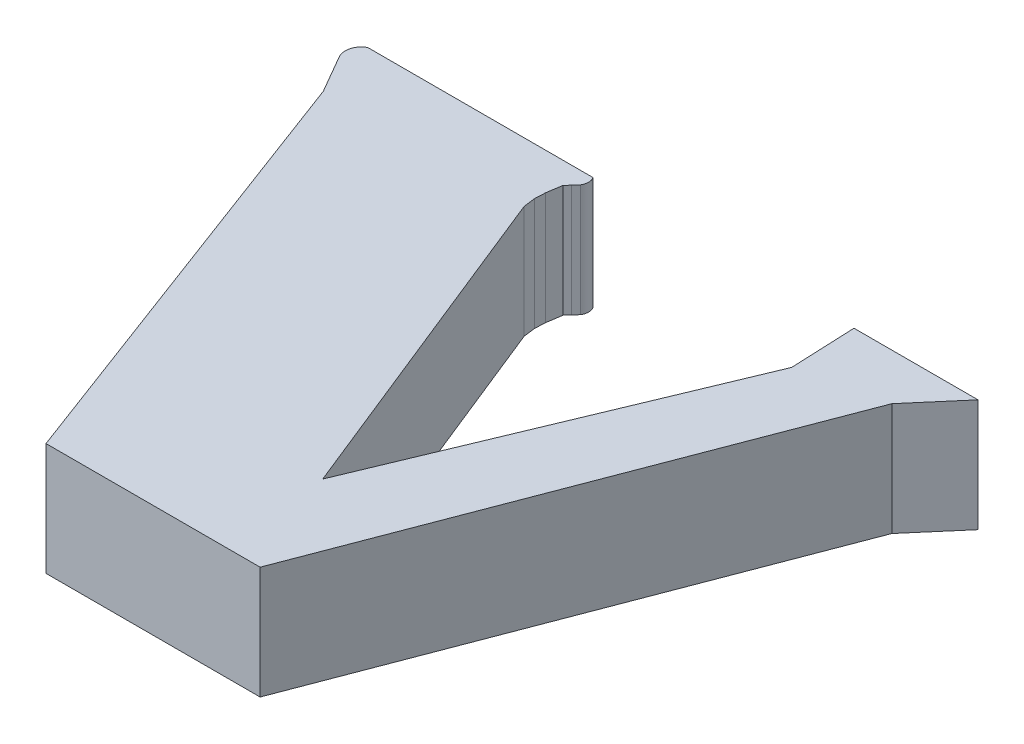
ISO-10303-21;
HEADER;
FILE_DESCRIPTION(('STEP AP214'),'2;1');
FILE_NAME('part.step','',(''),(''),'','','');
FILE_SCHEMA(('AUTOMOTIVE_DESIGN { 1 0 10303 214 1 1 1 1 }'));
ENDSEC;
DATA;
#1=APPLICATION_CONTEXT('core data for automotive mechanical design processes');
#2=APPLICATION_PROTOCOL_DEFINITION('international standard','automotive_design',2000,#1);
#3=PRODUCT_CONTEXT('',#1,'mechanical');
#4=PRODUCT('Part','Part','',(#3));
#5=PRODUCT_RELATED_PRODUCT_CATEGORY('part','',(#4));
#6=PRODUCT_DEFINITION_FORMATION('','',#4);
#7=PRODUCT_DEFINITION_CONTEXT('part definition',#1,'design');
#8=PRODUCT_DEFINITION('design','',#6,#7);
#9=PRODUCT_DEFINITION_SHAPE('','',#8);
#10=(LENGTH_UNIT() NAMED_UNIT(*) SI_UNIT(.MILLI.,.METRE.));
#11=(NAMED_UNIT(*) PLANE_ANGLE_UNIT() SI_UNIT($,.RADIAN.));
#12=(NAMED_UNIT(*) SI_UNIT($,.STERADIAN.) SOLID_ANGLE_UNIT());
#13=UNCERTAINTY_MEASURE_WITH_UNIT(LENGTH_MEASURE(1.E-05),#10,'distance_accuracy_value','');
#14=(GEOMETRIC_REPRESENTATION_CONTEXT(3) GLOBAL_UNCERTAINTY_ASSIGNED_CONTEXT((#13)) GLOBAL_UNIT_ASSIGNED_CONTEXT((#10,
#11,#12)) REPRESENTATION_CONTEXT('',''));
#15=CARTESIAN_POINT('',(0.,0.,0.));
#16=DIRECTION('',(0.,0.,1.));
#17=DIRECTION('',(1.,0.,0.));
#18=AXIS2_PLACEMENT_3D('',#15,#16,#17);
#19=CARTESIAN_POINT('',(60.4204006314875,66.7433443998356,51.260260517115));
#20=DIRECTION('',(0.,1.,0.));
#21=DIRECTION('',(1.,0.,0.));
#22=AXIS2_PLACEMENT_3D('',#19,#20,#21);
#23=PLANE('',#22);
#24=DIRECTION('',(0.351178794434307,0.,0.936308418385559));
#25=VECTOR('',#24,1.);
#26=CARTESIAN_POINT('',(58.4655751220041,66.7433443998356,51.788073542055));
#27=LINE('',#26,#25);
#28=CARTESIAN_POINT('',(58.4655751220041,66.7433443998356,51.788073542055));
#29=VERTEX_POINT('',#28);
#30=CARTESIAN_POINT('',(60.0930117335328,66.7433443998356,56.1271242589919));
#31=VERTEX_POINT('',#30);
#32=EDGE_CURVE('E404',#29,#31,#27,.T.);
#33=ORIENTED_EDGE('',*,*,#32,.F.);
#34=DIRECTION('',(0.500336982862697,0.,0.865830759201735));
#35=VECTOR('',#34,1.);
#36=CARTESIAN_POINT('',(58.2572211639987,66.7433443998356,51.4275180128389));
#37=LINE('',#36,#35);
#38=CARTESIAN_POINT('',(58.2572211639943,66.7433443998356,51.4275180128407));
#39=VERTEX_POINT('',#38);
#40=EDGE_CURVE('E26',#39,#29,#37,.T.);
#41=ORIENTED_EDGE('',*,*,#40,.F.);
#42=CARTESIAN_POINT('',(58.3891279958467,66.7433443998356,51.3379936652546));
#43=DIRECTION('',(0.,1.,0.));
#44=DIRECTION('',(1.,0.,0.));
#45=AXIS2_PLACEMENT_3D('',#42,#43,#44);
#46=CIRCLE('',#45,0.159417756539472);
#47=CARTESIAN_POINT('',(58.2297102393072,66.7433443998356,51.3379936652546));
#48=VERTEX_POINT('',#47);
#49=EDGE_CURVE('E381',#48,#39,#46,.T.);
#50=ORIENTED_EDGE('',*,*,#49,.F.);
#51=CARTESIAN_POINT('',(58.3891279958467,66.7433443998356,51.3379936652546));
#52=DIRECTION('',(0.,1.,0.));
#53=DIRECTION('',(1.,0.,0.));
#54=AXIS2_PLACEMENT_3D('',#51,#52,#53);
#55=CIRCLE('',#54,0.159417756539472);
#56=CARTESIAN_POINT('',(58.3108923087117,66.7433443998356,51.1990937071586));
#57=VERTEX_POINT('',#56);
#58=EDGE_CURVE('E167',#57,#48,#55,.T.);
#59=ORIENTED_EDGE('',*,*,#58,.F.);
#60=DIRECTION('',(-1.,0.,0.));
#61=VECTOR('',#60,1.);
#62=CARTESIAN_POINT('',(60.5154702295912,66.7433443998356,51.1990937071586));
#63=LINE('',#62,#61);
#64=CARTESIAN_POINT('',(60.5154702295979,66.7433443998356,51.1990937071595));
#65=VERTEX_POINT('',#64);
#66=EDGE_CURVE('E159',#65,#57,#63,.T.);
#67=ORIENTED_EDGE('',*,*,#66,.F.);
#68=CARTESIAN_POINT('',(60.4204006314875,66.7433443998356,51.260260517115));
#69=DIRECTION('',(0.,1.,0.));
#70=DIRECTION('',(1.,0.,0.));
#71=AXIS2_PLACEMENT_3D('',#68,#69,#70);
#72=CIRCLE('',#71,0.11304692443858);
#73=CARTESIAN_POINT('',(60.5154702295912,66.7433443998356,51.3214273270705));
#74=VERTEX_POINT('',#73);
#75=EDGE_CURVE('E163',#74,#65,#72,.T.);
#76=ORIENTED_EDGE('',*,*,#75,.F.);
#77=DIRECTION('',(0.655192979641865,0.,-0.755461553904641));
#78=VECTOR('',#77,1.);
#79=CARTESIAN_POINT('',(60.4733921812731,66.7433443998356,51.3699448612252));
#80=LINE('',#79,#78);
#81=CARTESIAN_POINT('',(60.4733921812731,66.7433443998356,51.3699448612252));
#82=VERTEX_POINT('',#81);
#83=EDGE_CURVE('E283',#82,#74,#80,.T.);
#84=ORIENTED_EDGE('',*,*,#83,.F.);
#85=DIRECTION('',(0.678534277173213,0.,-0.734568740623385));
#86=VECTOR('',#85,1.);
#87=CARTESIAN_POINT('',(60.4345512028035,66.7433443998356,51.4119933908261));
#88=LINE('',#87,#86);
#89=CARTESIAN_POINT('',(60.4345512028035,66.7433443998356,51.4119933908261));
#90=VERTEX_POINT('',#89);
#91=EDGE_CURVE('E266',#90,#82,#88,.T.);
#92=ORIENTED_EDGE('',*,*,#91,.F.);
#93=DIRECTION('',(0.149058888682834,0.,-0.988828320642486));
#94=VECTOR('',#93,1.);
#95=CARTESIAN_POINT('',(60.4123535006281,66.7433443998356,51.559248725669));
#96=LINE('',#95,#94);
#97=CARTESIAN_POINT('',(60.4123535006281,66.7433443998356,51.559248725669));
#98=VERTEX_POINT('',#97);
#99=EDGE_CURVE('E258',#98,#90,#96,.T.);
#100=ORIENTED_EDGE('',*,*,#99,.F.);
#101=DIRECTION('',(0.0475988154380199,0.,-0.998866534011876));
#102=VECTOR('',#101,1.);
#103=CARTESIAN_POINT('',(60.4073127950875,66.7433443998356,51.6650285024535));
#104=LINE('',#103,#102);
#105=CARTESIAN_POINT('',(60.4073127950875,66.7433443998356,51.6650285024535));
#106=VERTEX_POINT('',#105);
#107=EDGE_CURVE('E249',#106,#98,#104,.T.);
#108=ORIENTED_EDGE('',*,*,#107,.F.);
#109=DIRECTION('',(-0.126886204003881,0.,-0.991917280438992));
#110=VECTOR('',#109,1.);
#111=CARTESIAN_POINT('',(60.4218573272124,66.7433443998356,51.7787285919459));
#112=LINE('',#111,#110);
#113=CARTESIAN_POINT('',(60.4218573272124,66.7433443998356,51.7787285919459));
#114=VERTEX_POINT('',#113);
#115=EDGE_CURVE('E240',#114,#106,#112,.T.);
#116=ORIENTED_EDGE('',*,*,#115,.F.);
#117=DIRECTION('',(-0.373019319199074,0.,-0.927823575635077));
#118=VECTOR('',#117,1.);
#119=CARTESIAN_POINT('',(61.7469038906855,66.7433443998356,55.0745617489103));
#120=LINE('',#119,#118);
#121=CARTESIAN_POINT('',(61.7469038906855,66.7433443998356,55.0745617489103));
#122=VERTEX_POINT('',#121);
#123=EDGE_CURVE('E228',#122,#114,#120,.T.);
#124=ORIENTED_EDGE('',*,*,#123,.F.);
#125=DIRECTION('',(-0.384147707730565,0.,0.923271649432253));
#126=VECTOR('',#125,1.);
#127=CARTESIAN_POINT('',(63.0944544936692,66.7433443998356,51.8358198720936));
#128=LINE('',#127,#126);
#129=CARTESIAN_POINT('',(63.0944544936692,66.7433443998356,51.8358198720936));
#130=VERTEX_POINT('',#129);
#131=EDGE_CURVE('E219',#130,#122,#128,.T.);
#132=ORIENTED_EDGE('',*,*,#131,.F.);
#133=DIRECTION('',(0.0425885629400182,0.,0.999092695552672));
#134=VECTOR('',#133,1.);
#135=CARTESIAN_POINT('',(63.0673126153714,66.7433443998356,51.1990937071586));
#136=LINE('',#135,#134);
#137=CARTESIAN_POINT('',(63.0673126153714,66.7433443998356,51.1990937071586));
#138=VERTEX_POINT('',#137);
#139=EDGE_CURVE('E314',#138,#130,#136,.T.);
#140=ORIENTED_EDGE('',*,*,#139,.F.);
#141=DIRECTION('',(-1.,0.,0.));
#142=VECTOR('',#141,1.);
#143=CARTESIAN_POINT('',(64.2802944204693,66.7433443998356,51.1990937071586));
#144=LINE('',#143,#142);
#145=CARTESIAN_POINT('',(64.2802944204693,66.7433443998356,51.1990937071586));
#146=VERTEX_POINT('',#145);
#147=EDGE_CURVE('E302',#146,#138,#144,.T.);
#148=ORIENTED_EDGE('',*,*,#147,.F.);
#149=DIRECTION('',(0.650442835926794,0.,-0.759555210100958));
#150=VECTOR('',#149,1.);
#151=CARTESIAN_POINT('',(63.8916979560522,66.7433443998356,51.6528775800399));
#152=LINE('',#151,#150);
#153=CARTESIAN_POINT('',(63.8916979560522,66.7433443998356,51.6528775800399));
#154=VERTEX_POINT('',#153);
#155=EDGE_CURVE('E292',#154,#146,#152,.T.);
#156=ORIENTED_EDGE('',*,*,#155,.F.);
#157=DIRECTION('',(0.355999055886694,0.,-0.934486314617706));
#158=VECTOR('',#157,1.);
#159=CARTESIAN_POINT('',(62.1872025893516,66.7433443998356,56.1271242589919));
#160=LINE('',#159,#158);
#161=CARTESIAN_POINT('',(62.1872025893516,66.7433443998356,56.1271242589919));
#162=VERTEX_POINT('',#161);
#163=EDGE_CURVE('E288',#162,#154,#160,.T.);
#164=ORIENTED_EDGE('',*,*,#163,.F.);
#165=DIRECTION('',(1.,0.,0.));
#166=VECTOR('',#165,1.);
#167=CARTESIAN_POINT('',(60.0930117335328,66.7433443998356,56.1271242589919));
#168=LINE('',#167,#166);
#169=EDGE_CURVE('E426',#31,#162,#168,.T.);
#170=ORIENTED_EDGE('',*,*,#169,.F.);
#171=EDGE_LOOP('',(#33,#41,#50,#59,#67,#76,#84,#92,#100,#108,#116,#124,#132,#140,#148,#156,#164,#170));
#172=FACE_BOUND('',#171,.T.);
#173=ADVANCED_FACE('F16',(#172),#23,.F.);
#174=CARTESIAN_POINT('',(60.4204006314875,67.8433443998356,51.260260517115));
#175=DIRECTION('',(0.,1.,0.));
#176=DIRECTION('',(1.,0.,0.));
#177=AXIS2_PLACEMENT_3D('',#174,#175,#176);
#178=PLANE('',#177);
#179=DIRECTION('',(0.351178794434307,0.,0.936308418385559));
#180=VECTOR('',#179,1.);
#181=CARTESIAN_POINT('',(58.4655751220041,67.8433443998356,51.788073542055));
#182=LINE('',#181,#180);
#183=CARTESIAN_POINT('',(58.4655751220041,67.8433443998356,51.788073542055));
#184=VERTEX_POINT('',#183);
#185=CARTESIAN_POINT('',(60.0930117335328,67.8433443998356,56.1271242589919));
#186=VERTEX_POINT('',#185);
#187=EDGE_CURVE('E339',#184,#186,#182,.T.);
#188=ORIENTED_EDGE('',*,*,#187,.T.);
#189=DIRECTION('',(1.,0.,0.));
#190=VECTOR('',#189,1.);
#191=CARTESIAN_POINT('',(60.0930117335328,67.8433443998356,56.1271242589919));
#192=LINE('',#191,#190);
#193=CARTESIAN_POINT('',(62.1872025893516,67.8433443998356,56.1271242589919));
#194=VERTEX_POINT('',#193);
#195=EDGE_CURVE('E287',#186,#194,#192,.T.);
#196=ORIENTED_EDGE('',*,*,#195,.T.);
#197=DIRECTION('',(0.355999055886694,0.,-0.934486314617706));
#198=VECTOR('',#197,1.);
#199=CARTESIAN_POINT('',(62.1872025893516,67.8433443998356,56.1271242589919));
#200=LINE('',#199,#198);
#201=CARTESIAN_POINT('',(63.8916979560522,67.8433443998356,51.6528775800399));
#202=VERTEX_POINT('',#201);
#203=EDGE_CURVE('E296',#194,#202,#200,.T.);
#204=ORIENTED_EDGE('',*,*,#203,.T.);
#205=DIRECTION('',(0.650442835926794,0.,-0.759555210100958));
#206=VECTOR('',#205,1.);
#207=CARTESIAN_POINT('',(63.8916979560522,67.8433443998356,51.6528775800399));
#208=LINE('',#207,#206);
#209=CARTESIAN_POINT('',(64.2802944204693,67.8433443998356,51.1990937071586));
#210=VERTEX_POINT('',#209);
#211=EDGE_CURVE('E298',#202,#210,#208,.T.);
#212=ORIENTED_EDGE('',*,*,#211,.T.);
#213=DIRECTION('',(-1.,0.,0.));
#214=VECTOR('',#213,1.);
#215=CARTESIAN_POINT('',(64.2802944204693,67.8433443998356,51.1990937071586));
#216=LINE('',#215,#214);
#217=CARTESIAN_POINT('',(63.0673126153714,67.8433443998356,51.1990937071586));
#218=VERTEX_POINT('',#217);
#219=EDGE_CURVE('E309',#210,#218,#216,.T.);
#220=ORIENTED_EDGE('',*,*,#219,.T.);
#221=DIRECTION('',(0.0425885629400182,0.,0.999092695552672));
#222=VECTOR('',#221,1.);
#223=CARTESIAN_POINT('',(63.0673126153714,67.8433443998356,51.1990937071586));
#224=LINE('',#223,#222);
#225=CARTESIAN_POINT('',(63.0944544936692,67.8433443998356,51.8358198720936));
#226=VERTEX_POINT('',#225);
#227=EDGE_CURVE('E321',#218,#226,#224,.T.);
#228=ORIENTED_EDGE('',*,*,#227,.T.);
#229=DIRECTION('',(-0.384147707730565,0.,0.923271649432253));
#230=VECTOR('',#229,1.);
#231=CARTESIAN_POINT('',(63.0944544936692,67.8433443998356,51.8358198720936));
#232=LINE('',#231,#230);
#233=CARTESIAN_POINT('',(61.7469038906855,67.8433443998356,55.0745617489103));
#234=VERTEX_POINT('',#233);
#235=EDGE_CURVE('E224',#226,#234,#232,.T.);
#236=ORIENTED_EDGE('',*,*,#235,.T.);
#237=DIRECTION('',(-0.373019319199075,0.,-0.927823575635077));
#238=VECTOR('',#237,1.);
#239=CARTESIAN_POINT('',(61.7469038906855,67.8433443998356,55.0745617489103));
#240=LINE('',#239,#238);
#241=CARTESIAN_POINT('',(60.4218573272124,67.8433443998356,51.7787285919459));
#242=VERTEX_POINT('',#241);
#243=EDGE_CURVE('E236',#234,#242,#240,.T.);
#244=ORIENTED_EDGE('',*,*,#243,.T.);
#245=DIRECTION('',(-0.126886204003881,0.,-0.991917280438992));
#246=VECTOR('',#245,1.);
#247=CARTESIAN_POINT('',(60.4218573272124,67.8433443998356,51.7787285919459));
#248=LINE('',#247,#246);
#249=CARTESIAN_POINT('',(60.4073127950875,67.8433443998356,51.6650285024535));
#250=VERTEX_POINT('',#249);
#251=EDGE_CURVE('E245',#242,#250,#248,.T.);
#252=ORIENTED_EDGE('',*,*,#251,.T.);
#253=DIRECTION('',(0.0475988154380199,0.,-0.998866534011876));
#254=VECTOR('',#253,1.);
#255=CARTESIAN_POINT('',(60.4073127950875,67.8433443998356,51.6650285024535));
#256=LINE('',#255,#254);
#257=CARTESIAN_POINT('',(60.4123535006281,67.8433443998356,51.559248725669));
#258=VERTEX_POINT('',#257);
#259=EDGE_CURVE('E254',#250,#258,#256,.T.);
#260=ORIENTED_EDGE('',*,*,#259,.T.);
#261=DIRECTION('',(0.149058888682834,0.,-0.988828320642486));
#262=VECTOR('',#261,1.);
#263=CARTESIAN_POINT('',(60.4123535006281,67.8433443998356,51.559248725669));
#264=LINE('',#263,#262);
#265=CARTESIAN_POINT('',(60.4345512028035,67.8433443998356,51.4119933908261));
#266=VERTEX_POINT('',#265);
#267=EDGE_CURVE('E263',#258,#266,#264,.T.);
#268=ORIENTED_EDGE('',*,*,#267,.T.);
#269=DIRECTION('',(0.678534277173213,0.,-0.734568740623385));
#270=VECTOR('',#269,1.);
#271=CARTESIAN_POINT('',(60.4345512028035,67.8433443998356,51.4119933908261));
#272=LINE('',#271,#270);
#273=CARTESIAN_POINT('',(60.4733921812731,67.8433443998356,51.3699448612252));
#274=VERTEX_POINT('',#273);
#275=EDGE_CURVE('E275',#266,#274,#272,.T.);
#276=ORIENTED_EDGE('',*,*,#275,.T.);
#277=DIRECTION('',(0.655192979641865,0.,-0.755461553904641));
#278=VECTOR('',#277,1.);
#279=CARTESIAN_POINT('',(60.4733921812731,67.8433443998356,51.3699448612252));
#280=LINE('',#279,#278);
#281=CARTESIAN_POINT('',(60.5154702295912,67.8433443998356,51.3214273270705));
#282=VERTEX_POINT('',#281);
#283=EDGE_CURVE('E187',#274,#282,#280,.T.);
#284=ORIENTED_EDGE('',*,*,#283,.T.);
#285=CARTESIAN_POINT('',(60.4204006314875,67.8433443998356,51.260260517115));
#286=DIRECTION('',(0.,1.,0.));
#287=DIRECTION('',(0.,0.,1.));
#288=AXIS2_PLACEMENT_3D('',#285,#286,#287);
#289=CIRCLE('',#288,0.11304692443858);
#290=CARTESIAN_POINT('',(60.5154702295979,67.8433443998356,51.1990937071595));
#291=VERTEX_POINT('',#290);
#292=EDGE_CURVE('E172',#282,#291,#289,.T.);
#293=ORIENTED_EDGE('',*,*,#292,.T.);
#294=DIRECTION('',(-1.,0.,0.));
#295=VECTOR('',#294,1.);
#296=CARTESIAN_POINT('',(60.5154702295912,67.8433443998356,51.1990937071586));
#297=LINE('',#296,#295);
#298=CARTESIAN_POINT('',(58.3108923087117,67.8433443998356,51.1990937071586));
#299=VERTEX_POINT('',#298);
#300=EDGE_CURVE('E177',#291,#299,#297,.T.);
#301=ORIENTED_EDGE('',*,*,#300,.T.);
#302=CARTESIAN_POINT('',(58.3891279958467,67.8433443998356,51.3379936652546));
#303=DIRECTION('',(0.,1.,0.));
#304=DIRECTION('',(0.,0.,1.));
#305=AXIS2_PLACEMENT_3D('',#302,#303,#304);
#306=CIRCLE('',#305,0.159417756539472);
#307=CARTESIAN_POINT('',(58.2297102393072,67.8433443998356,51.3379936652546));
#308=VERTEX_POINT('',#307);
#309=EDGE_CURVE('E38',#299,#308,#306,.T.);
#310=ORIENTED_EDGE('',*,*,#309,.T.);
#311=CARTESIAN_POINT('',(58.3891279958467,67.8433443998356,51.3379936652546));
#312=DIRECTION('',(0.,1.,0.));
#313=DIRECTION('',(0.,0.,1.));
#314=AXIS2_PLACEMENT_3D('',#311,#312,#313);
#315=CIRCLE('',#314,0.159417756539472);
#316=CARTESIAN_POINT('',(58.2572211639943,67.8433443998356,51.4275180128407));
#317=VERTEX_POINT('',#316);
#318=EDGE_CURVE('E382',#308,#317,#315,.T.);
#319=ORIENTED_EDGE('',*,*,#318,.T.);
#320=DIRECTION('',(0.500336982862697,0.,0.865830759201735));
#321=VECTOR('',#320,1.);
#322=CARTESIAN_POINT('',(58.2572211639987,67.8433443998356,51.4275180128389));
#323=LINE('',#322,#321);
#324=EDGE_CURVE('E11',#317,#184,#323,.T.);
#325=ORIENTED_EDGE('',*,*,#324,.T.);
#326=EDGE_LOOP('',(#188,#196,#204,#212,#220,#228,#236,#244,#252,#260,#268,#276,#284,#293,#301,
#310,#319,#325));
#327=FACE_BOUND('',#326,.T.);
#328=ADVANCED_FACE('F18',(#327),#178,.T.);
#329=CARTESIAN_POINT('',(58.2572211639987,67.7433443998356,51.4275180128389));
#330=DIRECTION('',(0.865830759201735,0.,-0.500336982862697));
#331=DIRECTION('',(0.,-1.,0.));
#332=AXIS2_PLACEMENT_3D('',#329,#330,#331);
#333=PLANE('',#332);
#334=ORIENTED_EDGE('',*,*,#40,.T.);
#335=DIRECTION('',(0.,-1.,0.));
#336=VECTOR('',#335,1.);
#337=CARTESIAN_POINT('',(58.4655751220041,67.7433443998356,51.788073542055));
#338=LINE('',#337,#336);
#339=EDGE_CURVE('E423',#184,#29,#338,.T.);
#340=ORIENTED_EDGE('',*,*,#339,.F.);
#341=ORIENTED_EDGE('',*,*,#324,.F.);
#342=DIRECTION('',(0.,-1.,0.));
#343=VECTOR('',#342,1.);
#344=CARTESIAN_POINT('',(58.2572211639943,67.7433443998356,51.4275180128407));
#345=LINE('',#344,#343);
#346=EDGE_CURVE('E387',#317,#39,#345,.T.);
#347=ORIENTED_EDGE('',*,*,#346,.T.);
#348=EDGE_LOOP('',(#334,#340,#341,#347));
#349=FACE_BOUND('',#348,.T.);
#350=ADVANCED_FACE('F342',(#349),#333,.F.);
#351=CARTESIAN_POINT('',(58.3891279958467,67.7433443998356,51.3379936652546));
#352=DIRECTION('',(0.,-1.,0.));
#353=DIRECTION('',(-1.,0.,0.));
#354=AXIS2_PLACEMENT_3D('',#351,#352,#353);
#355=CYLINDRICAL_SURFACE('',#354,0.159417756539472);
#356=DIRECTION('',(0.,-1.,0.));
#357=VECTOR('',#356,1.);
#358=CARTESIAN_POINT('',(58.2297102393072,67.7433443998356,51.3379936652546));
#359=LINE('',#358,#357);
#360=EDGE_CURVE('E373',#308,#48,#359,.T.);
#361=ORIENTED_EDGE('',*,*,#360,.F.);
#362=ORIENTED_EDGE('',*,*,#309,.F.);
#363=DIRECTION('',(0.,-1.,0.));
#364=VECTOR('',#363,1.);
#365=CARTESIAN_POINT('',(58.3108923087117,67.7433443998356,51.1990937071586));
#366=LINE('',#365,#364);
#367=EDGE_CURVE('E171',#299,#57,#366,.T.);
#368=ORIENTED_EDGE('',*,*,#367,.T.);
#369=ORIENTED_EDGE('',*,*,#58,.T.);
#370=EDGE_LOOP('',(#361,#362,#368,#369));
#371=FACE_BOUND('',#370,.T.);
#372=ADVANCED_FACE('F348',(#371),#355,.T.);
#373=CARTESIAN_POINT('',(60.5154702295912,67.7433443998356,51.1990937071586));
#374=DIRECTION('',(0.,0.,1.));
#375=DIRECTION('',(1.,0.,0.));
#376=AXIS2_PLACEMENT_3D('',#373,#374,#375);
#377=PLANE('',#376);
#378=ORIENTED_EDGE('',*,*,#66,.T.);
#379=ORIENTED_EDGE('',*,*,#367,.F.);
#380=ORIENTED_EDGE('',*,*,#300,.F.);
#381=DIRECTION('',(0.,-1.,0.));
#382=VECTOR('',#381,1.);
#383=CARTESIAN_POINT('',(60.5154702295979,67.7433443998356,51.1990937071595));
#384=LINE('',#383,#382);
#385=EDGE_CURVE('E175',#291,#65,#384,.T.);
#386=ORIENTED_EDGE('',*,*,#385,.T.);
#387=EDGE_LOOP('',(#378,#379,#380,#386));
#388=FACE_BOUND('',#387,.T.);
#389=ADVANCED_FACE('F176',(#388),#377,.F.);
#390=CARTESIAN_POINT('',(60.4204006314875,67.7433443998356,51.260260517115));
#391=DIRECTION('',(0.,-1.,0.));
#392=DIRECTION('',(-1.,0.,0.));
#393=AXIS2_PLACEMENT_3D('',#390,#391,#392);
#394=CYLINDRICAL_SURFACE('',#393,0.11304692443858);
#395=ORIENTED_EDGE('',*,*,#75,.T.);
#396=ORIENTED_EDGE('',*,*,#385,.F.);
#397=ORIENTED_EDGE('',*,*,#292,.F.);
#398=DIRECTION('',(0.,-1.,0.));
#399=VECTOR('',#398,1.);
#400=CARTESIAN_POINT('',(60.5154702295912,67.7433443998356,51.3214273270705));
#401=LINE('',#400,#399);
#402=EDGE_CURVE('E184',#282,#74,#401,.T.);
#403=ORIENTED_EDGE('',*,*,#402,.T.);
#404=EDGE_LOOP('',(#395,#396,#397,#403));
#405=FACE_BOUND('',#404,.T.);
#406=ADVANCED_FACE('F182',(#405),#394,.T.);
#407=CARTESIAN_POINT('',(60.4733921812731,67.7433443998356,51.3699448612252));
#408=DIRECTION('',(-0.755461553904641,0.,-0.655192979641865));
#409=DIRECTION('',(-0.655192979641865,0.,0.755461553904641));
#410=AXIS2_PLACEMENT_3D('',#407,#408,#409);
#411=PLANE('',#410);
#412=ORIENTED_EDGE('',*,*,#83,.T.);
#413=ORIENTED_EDGE('',*,*,#402,.F.);
#414=ORIENTED_EDGE('',*,*,#283,.F.);
#415=DIRECTION('',(0.,-1.,0.));
#416=VECTOR('',#415,1.);
#417=CARTESIAN_POINT('',(60.4733921812731,67.7433443998356,51.3699448612252));
#418=LINE('',#417,#416);
#419=EDGE_CURVE('E269',#274,#82,#418,.T.);
#420=ORIENTED_EDGE('',*,*,#419,.T.);
#421=EDGE_LOOP('',(#412,#413,#414,#420));
#422=FACE_BOUND('',#421,.T.);
#423=ADVANCED_FACE('F363',(#422),#411,.F.);
#424=CARTESIAN_POINT('',(60.4345512028035,67.7433443998356,51.4119933908261));
#425=DIRECTION('',(-0.734568740623385,0.,-0.678534277173213));
#426=DIRECTION('',(-0.678534277173213,0.,0.734568740623385));
#427=AXIS2_PLACEMENT_3D('',#424,#425,#426);
#428=PLANE('',#427);
#429=ORIENTED_EDGE('',*,*,#91,.T.);
#430=ORIENTED_EDGE('',*,*,#419,.F.);
#431=ORIENTED_EDGE('',*,*,#275,.F.);
#432=DIRECTION('',(0.,-1.,0.));
#433=VECTOR('',#432,1.);
#434=CARTESIAN_POINT('',(60.4345512028035,67.7433443998356,51.4119933908261));
#435=LINE('',#434,#433);
#436=EDGE_CURVE('E259',#266,#90,#435,.T.);
#437=ORIENTED_EDGE('',*,*,#436,.T.);
#438=EDGE_LOOP('',(#429,#430,#431,#437));
#439=FACE_BOUND('',#438,.T.);
#440=ADVANCED_FACE('F359',(#439),#428,.F.);
#441=CARTESIAN_POINT('',(60.4123535006281,67.7433443998356,51.559248725669));
#442=DIRECTION('',(-0.988828320642486,0.,-0.149058888682834));
#443=DIRECTION('',(-0.149058888682834,0.,0.988828320642486));
#444=AXIS2_PLACEMENT_3D('',#441,#442,#443);
#445=PLANE('',#444);
#446=ORIENTED_EDGE('',*,*,#99,.T.);
#447=ORIENTED_EDGE('',*,*,#436,.F.);
#448=ORIENTED_EDGE('',*,*,#267,.F.);
#449=DIRECTION('',(0.,-1.,0.));
#450=VECTOR('',#449,1.);
#451=CARTESIAN_POINT('',(60.4123535006281,67.7433443998356,51.559248725669));
#452=LINE('',#451,#450);
#453=EDGE_CURVE('E250',#258,#98,#452,.T.);
#454=ORIENTED_EDGE('',*,*,#453,.T.);
#455=EDGE_LOOP('',(#446,#447,#448,#454));
#456=FACE_BOUND('',#455,.T.);
#457=ADVANCED_FACE('F362',(#456),#445,.F.);
#458=CARTESIAN_POINT('',(60.4073127950875,67.7433443998356,51.6650285024535));
#459=DIRECTION('',(-0.998866534011876,0.,-0.0475988154380199));
#460=DIRECTION('',(-0.0475988154380199,0.,0.998866534011876));
#461=AXIS2_PLACEMENT_3D('',#458,#459,#460);
#462=PLANE('',#461);
#463=ORIENTED_EDGE('',*,*,#107,.T.);
#464=ORIENTED_EDGE('',*,*,#453,.F.);
#465=ORIENTED_EDGE('',*,*,#259,.F.);
#466=DIRECTION('',(0.,-1.,0.));
#467=VECTOR('',#466,1.);
#468=CARTESIAN_POINT('',(60.4073127950875,67.7433443998356,51.6650285024535));
#469=LINE('',#468,#467);
#470=EDGE_CURVE('E241',#250,#106,#469,.T.);
#471=ORIENTED_EDGE('',*,*,#470,.T.);
#472=EDGE_LOOP('',(#463,#464,#465,#471));
#473=FACE_BOUND('',#472,.T.);
#474=ADVANCED_FACE('F354',(#473),#462,.F.);
#475=CARTESIAN_POINT('',(60.4218573272124,67.7433443998356,51.7787285919459));
#476=DIRECTION('',(-0.991917280438992,0.,0.126886204003881));
#477=DIRECTION('',(0.,1.,0.));
#478=AXIS2_PLACEMENT_3D('',#475,#476,#477);
#479=PLANE('',#478);
#480=ORIENTED_EDGE('',*,*,#115,.T.);
#481=ORIENTED_EDGE('',*,*,#470,.F.);
#482=ORIENTED_EDGE('',*,*,#251,.F.);
#483=DIRECTION('',(0.,-1.,0.));
#484=VECTOR('',#483,1.);
#485=CARTESIAN_POINT('',(60.4218573272124,67.7433443998356,51.7787285919459));
#486=LINE('',#485,#484);
#487=EDGE_CURVE('E232',#242,#114,#486,.T.);
#488=ORIENTED_EDGE('',*,*,#487,.T.);
#489=EDGE_LOOP('',(#480,#481,#482,#488));
#490=FACE_BOUND('',#489,.T.);
#491=ADVANCED_FACE('F472',(#490),#479,.F.);
#492=CARTESIAN_POINT('',(61.7469038906855,67.7433443998356,55.0745617489103));
#493=DIRECTION('',(-0.927823575635077,0.,0.373019319199075));
#494=DIRECTION('',(0.,1.,0.));
#495=AXIS2_PLACEMENT_3D('',#492,#493,#494);
#496=PLANE('',#495);
#497=ORIENTED_EDGE('',*,*,#123,.T.);
#498=ORIENTED_EDGE('',*,*,#487,.F.);
#499=ORIENTED_EDGE('',*,*,#243,.F.);
#500=DIRECTION('',(0.,-1.,0.));
#501=VECTOR('',#500,1.);
#502=CARTESIAN_POINT('',(61.7469038906855,67.7433443998356,55.0745617489103));
#503=LINE('',#502,#501);
#504=EDGE_CURVE('E221',#234,#122,#503,.T.);
#505=ORIENTED_EDGE('',*,*,#504,.T.);
#506=EDGE_LOOP('',(#497,#498,#499,#505));
#507=FACE_BOUND('',#506,.T.);
#508=ADVANCED_FACE('F335',(#507),#496,.F.);
#509=CARTESIAN_POINT('',(63.0944544936692,67.7433443998356,51.8358198720936));
#510=DIRECTION('',(0.923271649432253,0.,0.384147707730565));
#511=DIRECTION('',(0.,-1.,0.));
#512=AXIS2_PLACEMENT_3D('',#509,#510,#511);
#513=PLANE('',#512);
#514=ORIENTED_EDGE('',*,*,#131,.T.);
#515=ORIENTED_EDGE('',*,*,#504,.F.);
#516=ORIENTED_EDGE('',*,*,#235,.F.);
#517=DIRECTION('',(0.,-1.,0.));
#518=VECTOR('',#517,1.);
#519=CARTESIAN_POINT('',(63.0944544936692,67.7433443998356,51.8358198720936));
#520=LINE('',#519,#518);
#521=EDGE_CURVE('E318',#226,#130,#520,.T.);
#522=ORIENTED_EDGE('',*,*,#521,.T.);
#523=EDGE_LOOP('',(#514,#515,#516,#522));
#524=FACE_BOUND('',#523,.T.);
#525=ADVANCED_FACE('F331',(#524),#513,.F.);
#526=CARTESIAN_POINT('',(63.0673126153714,67.7433443998356,51.1990937071586));
#527=DIRECTION('',(0.999092695552672,0.,-0.0425885629400182));
#528=DIRECTION('',(0.,-1.,0.));
#529=AXIS2_PLACEMENT_3D('',#526,#527,#528);
#530=PLANE('',#529);
#531=ORIENTED_EDGE('',*,*,#139,.T.);
#532=ORIENTED_EDGE('',*,*,#521,.F.);
#533=ORIENTED_EDGE('',*,*,#227,.F.);
#534=DIRECTION('',(0.,-1.,0.));
#535=VECTOR('',#534,1.);
#536=CARTESIAN_POINT('',(63.0673126153714,67.7433443998356,51.1990937071586));
#537=LINE('',#536,#535);
#538=EDGE_CURVE('E306',#218,#138,#537,.T.);
#539=ORIENTED_EDGE('',*,*,#538,.T.);
#540=EDGE_LOOP('',(#531,#532,#533,#539));
#541=FACE_BOUND('',#540,.T.);
#542=ADVANCED_FACE('F358',(#541),#530,.F.);
#543=CARTESIAN_POINT('',(64.2802944204693,67.7433443998356,51.1990937071586));
#544=DIRECTION('',(0.,0.,1.));
#545=DIRECTION('',(1.,0.,0.));
#546=AXIS2_PLACEMENT_3D('',#543,#544,#545);
#547=PLANE('',#546);
#548=ORIENTED_EDGE('',*,*,#147,.T.);
#549=ORIENTED_EDGE('',*,*,#538,.F.);
#550=ORIENTED_EDGE('',*,*,#219,.F.);
#551=DIRECTION('',(0.,-1.,0.));
#552=VECTOR('',#551,1.);
#553=CARTESIAN_POINT('',(64.2802944204693,67.7433443998356,51.1990937071586));
#554=LINE('',#553,#552);
#555=EDGE_CURVE('E295',#210,#146,#554,.T.);
#556=ORIENTED_EDGE('',*,*,#555,.T.);
#557=EDGE_LOOP('',(#548,#549,#550,#556));
#558=FACE_BOUND('',#557,.T.);
#559=ADVANCED_FACE('F478',(#558),#547,.F.);
#560=CARTESIAN_POINT('',(63.8916979560522,67.7433443998356,51.6528775800399));
#561=DIRECTION('',(-0.759555210100958,0.,-0.650442835926794));
#562=DIRECTION('',(-0.650442835926794,0.,0.759555210100958));
#563=AXIS2_PLACEMENT_3D('',#560,#561,#562);
#564=PLANE('',#563);
#565=ORIENTED_EDGE('',*,*,#155,.T.);
#566=ORIENTED_EDGE('',*,*,#555,.F.);
#567=ORIENTED_EDGE('',*,*,#211,.F.);
#568=DIRECTION('',(0.,-1.,0.));
#569=VECTOR('',#568,1.);
#570=CARTESIAN_POINT('',(63.8916979560522,67.7433443998356,51.6528775800399));
#571=LINE('',#570,#569);
#572=EDGE_CURVE('E291',#202,#154,#571,.T.);
#573=ORIENTED_EDGE('',*,*,#572,.T.);
#574=EDGE_LOOP('',(#565,#566,#567,#573));
#575=FACE_BOUND('',#574,.T.);
#576=ADVANCED_FACE('F471',(#575),#564,.F.);
#577=CARTESIAN_POINT('',(62.1872025893516,67.7433443998356,56.1271242589919));
#578=DIRECTION('',(-0.934486314617707,0.,-0.355999055886693));
#579=DIRECTION('',(-0.355999055886693,0.,0.934486314617707));
#580=AXIS2_PLACEMENT_3D('',#577,#578,#579);
#581=PLANE('',#580);
#582=ORIENTED_EDGE('',*,*,#163,.T.);
#583=ORIENTED_EDGE('',*,*,#572,.F.);
#584=ORIENTED_EDGE('',*,*,#203,.F.);
#585=DIRECTION('',(0.,-1.,0.));
#586=VECTOR('',#585,1.);
#587=CARTESIAN_POINT('',(62.1872025893516,67.7433443998356,56.1271242589919));
#588=LINE('',#587,#586);
#589=EDGE_CURVE('E432',#194,#162,#588,.T.);
#590=ORIENTED_EDGE('',*,*,#589,.T.);
#591=EDGE_LOOP('',(#582,#583,#584,#590));
#592=FACE_BOUND('',#591,.T.);
#593=ADVANCED_FACE('F443',(#592),#581,.F.);
#594=CARTESIAN_POINT('',(60.0930117335328,67.7433443998356,56.1271242589919));
#595=DIRECTION('',(0.,0.,-1.));
#596=DIRECTION('',(0.,-1.,0.));
#597=AXIS2_PLACEMENT_3D('',#594,#595,#596);
#598=PLANE('',#597);
#599=ORIENTED_EDGE('',*,*,#169,.T.);
#600=ORIENTED_EDGE('',*,*,#589,.F.);
#601=ORIENTED_EDGE('',*,*,#195,.F.);
#602=DIRECTION('',(0.,-1.,0.));
#603=VECTOR('',#602,1.);
#604=CARTESIAN_POINT('',(60.0930117335328,67.7433443998356,56.1271242589919));
#605=LINE('',#604,#603);
#606=EDGE_CURVE('E414',#186,#31,#605,.T.);
#607=ORIENTED_EDGE('',*,*,#606,.T.);
#608=EDGE_LOOP('',(#599,#600,#601,#607));
#609=FACE_BOUND('',#608,.T.);
#610=ADVANCED_FACE('F441',(#609),#598,.F.);
#611=CARTESIAN_POINT('',(58.4655751220041,67.7433443998356,51.788073542055));
#612=DIRECTION('',(0.936308418385559,0.,-0.351178794434307));
#613=DIRECTION('',(0.,-1.,0.));
#614=AXIS2_PLACEMENT_3D('',#611,#612,#613);
#615=PLANE('',#614);
#616=ORIENTED_EDGE('',*,*,#32,.T.);
#617=ORIENTED_EDGE('',*,*,#606,.F.);
#618=ORIENTED_EDGE('',*,*,#187,.F.);
#619=ORIENTED_EDGE('',*,*,#339,.T.);
#620=EDGE_LOOP('',(#616,#617,#618,#619));
#621=FACE_BOUND('',#620,.T.);
#622=ADVANCED_FACE('F457',(#621),#615,.F.);
#623=CARTESIAN_POINT('',(58.3891279958467,67.7433443998356,51.3379936652546));
#624=DIRECTION('',(0.,-1.,0.));
#625=DIRECTION('',(-1.,0.,0.));
#626=AXIS2_PLACEMENT_3D('',#623,#624,#625);
#627=CYLINDRICAL_SURFACE('',#626,0.159417756539472);
#628=ORIENTED_EDGE('',*,*,#318,.F.);
#629=ORIENTED_EDGE('',*,*,#360,.T.);
#630=ORIENTED_EDGE('',*,*,#49,.T.);
#631=ORIENTED_EDGE('',*,*,#346,.F.);
#632=EDGE_LOOP('',(#628,#629,#630,#631));
#633=FACE_BOUND('',#632,.T.);
#634=ADVANCED_FACE('F386',(#633),#627,.T.);
#635=CLOSED_SHELL('',(#173,#328,#350,#372,#389,#406,#423,#440,#457,#474,#491,#508,#525,#542,
#559,#576,#593,#610,#622,#634));
#636=MANIFOLD_SOLID_BREP('B1',#635);
#637=ADVANCED_BREP_SHAPE_REPRESENTATION('',(#18,#636),#14);
#638=SHAPE_DEFINITION_REPRESENTATION(#9,#637);
ENDSEC;
END-ISO-10303-21;
